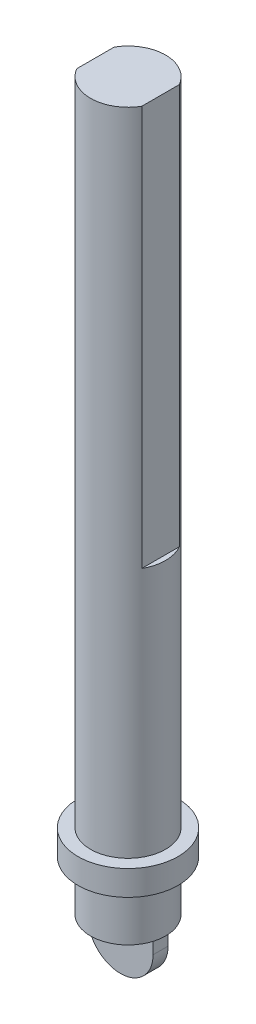
ISO-10303-21;
HEADER;
FILE_DESCRIPTION(('STEP AP214'),'2;1');
FILE_NAME('part.step','',(''),(''),'','','');
FILE_SCHEMA(('AUTOMOTIVE_DESIGN { 1 0 10303 214 1 1 1 1 }'));
ENDSEC;
DATA;
#1=APPLICATION_CONTEXT('core data for automotive mechanical design processes');
#2=APPLICATION_PROTOCOL_DEFINITION('international standard','automotive_design',2000,#1);
#3=PRODUCT_CONTEXT('',#1,'mechanical');
#4=PRODUCT('Part','Part','',(#3));
#5=PRODUCT_RELATED_PRODUCT_CATEGORY('part','',(#4));
#6=PRODUCT_DEFINITION_FORMATION('','',#4);
#7=PRODUCT_DEFINITION_CONTEXT('part definition',#1,'design');
#8=PRODUCT_DEFINITION('design','',#6,#7);
#9=PRODUCT_DEFINITION_SHAPE('','',#8);
#10=(LENGTH_UNIT() NAMED_UNIT(*) SI_UNIT(.MILLI.,.METRE.));
#11=(NAMED_UNIT(*) PLANE_ANGLE_UNIT() SI_UNIT($,.RADIAN.));
#12=(NAMED_UNIT(*) SI_UNIT($,.STERADIAN.) SOLID_ANGLE_UNIT());
#13=UNCERTAINTY_MEASURE_WITH_UNIT(LENGTH_MEASURE(1.E-05),#10,'distance_accuracy_value','');
#14=(GEOMETRIC_REPRESENTATION_CONTEXT(3) GLOBAL_UNCERTAINTY_ASSIGNED_CONTEXT((#13)) GLOBAL_UNIT_ASSIGNED_CONTEXT((#10,
#11,#12)) REPRESENTATION_CONTEXT('',''));
#15=CARTESIAN_POINT('',(0.,0.,0.));
#16=DIRECTION('',(0.,0.,1.));
#17=DIRECTION('',(1.,0.,0.));
#18=AXIS2_PLACEMENT_3D('',#15,#16,#17);
#19=CARTESIAN_POINT('',(0.,-15.,0.));
#20=DIRECTION('',(0.,-1.,0.));
#21=DIRECTION('',(0.,0.,-1.));
#22=AXIS2_PLACEMENT_3D('',#19,#20,#21);
#23=PLANE('',#22);
#24=CARTESIAN_POINT('',(0.,-15.,0.));
#25=DIRECTION('',(0.,-1.,0.));
#26=DIRECTION('',(0.,0.,-1.));
#27=AXIS2_PLACEMENT_3D('',#24,#25,#26);
#28=CIRCLE('',#27,7.5);
#29=CARTESIAN_POINT('',(0.,-15.,-7.5));
#30=VERTEX_POINT('',#29);
#31=EDGE_CURVE('E181',#30,#30,#28,.T.);
#32=ORIENTED_EDGE('',*,*,#31,.T.);
#33=EDGE_LOOP('',(#32));
#34=FACE_BOUND('',#33,.T.);
#35=DIRECTION('',(-1.,0.,0.));
#36=VECTOR('',#35,1.);
#37=CARTESIAN_POINT('',(-6.5,-15.,-1.5));
#38=LINE('',#37,#36);
#39=CARTESIAN_POINT('',(6.5,-15.,-1.5));
#40=VERTEX_POINT('',#39);
#41=CARTESIAN_POINT('',(-6.5,-15.,-1.5));
#42=VERTEX_POINT('',#41);
#43=EDGE_CURVE('E172',#40,#42,#38,.T.);
#44=ORIENTED_EDGE('',*,*,#43,.T.);
#45=DIRECTION('',(0.,0.,1.));
#46=VECTOR('',#45,1.);
#47=CARTESIAN_POINT('',(-6.5,-15.,-1.5));
#48=LINE('',#47,#46);
#49=CARTESIAN_POINT('',(-6.5,-15.,1.5));
#50=VERTEX_POINT('',#49);
#51=EDGE_CURVE('E177',#42,#50,#48,.T.);
#52=ORIENTED_EDGE('',*,*,#51,.T.);
#53=DIRECTION('',(-1.,0.,0.));
#54=VECTOR('',#53,1.);
#55=CARTESIAN_POINT('',(-6.5,-15.,1.5));
#56=LINE('',#55,#54);
#57=CARTESIAN_POINT('',(6.5,-15.,1.5));
#58=VERTEX_POINT('',#57);
#59=EDGE_CURVE('E158',#58,#50,#56,.T.);
#60=ORIENTED_EDGE('',*,*,#59,.F.);
#61=DIRECTION('',(0.,0.,1.));
#62=VECTOR('',#61,1.);
#63=CARTESIAN_POINT('',(6.5,-15.,-1.5));
#64=LINE('',#63,#62);
#65=EDGE_CURVE('E182',#40,#58,#64,.T.);
#66=ORIENTED_EDGE('',*,*,#65,.F.);
#67=EDGE_LOOP('',(#44,#52,#60,#66));
#68=FACE_BOUND('',#67,.T.);
#69=ADVANCED_FACE('F39',(#34,#68),#23,.T.);
#70=CARTESIAN_POINT('',(0.,130.,0.));
#71=DIRECTION('',(0.,-1.,0.));
#72=DIRECTION('',(0.,0.,-1.));
#73=AXIS2_PLACEMENT_3D('',#70,#71,#72);
#74=CYLINDRICAL_SURFACE('',#73,7.5);
#75=CARTESIAN_POINT('',(0.,130.,0.));
#76=DIRECTION('',(0.,1.,0.));
#77=DIRECTION('',(0.,0.,1.));
#78=AXIS2_PLACEMENT_3D('',#75,#76,#77);
#79=CIRCLE('',#78,7.5);
#80=CARTESIAN_POINT('',(6.5,130.,-3.74165738677394));
#81=VERTEX_POINT('',#80);
#82=CARTESIAN_POINT('',(-6.5,130.,-3.74165738677394));
#83=VERTEX_POINT('',#82);
#84=EDGE_CURVE('E49',#81,#83,#79,.T.);
#85=ORIENTED_EDGE('',*,*,#84,.F.);
#86=DIRECTION('',(0.,1.,0.));
#87=VECTOR('',#86,1.);
#88=CARTESIAN_POINT('',(6.5,50.,-3.74165738677394));
#89=LINE('',#88,#87);
#90=CARTESIAN_POINT('',(6.5,50.,-3.74165738677394));
#91=VERTEX_POINT('',#90);
#92=EDGE_CURVE('E65',#91,#81,#89,.T.);
#93=ORIENTED_EDGE('',*,*,#92,.F.);
#94=CARTESIAN_POINT('',(0.,50.,0.));
#95=DIRECTION('',(0.,1.,0.));
#96=DIRECTION('',(0.,0.,1.));
#97=AXIS2_PLACEMENT_3D('',#94,#95,#96);
#98=CIRCLE('',#97,7.5);
#99=CARTESIAN_POINT('',(6.5,50.,3.74165738677394));
#100=VERTEX_POINT('',#99);
#101=EDGE_CURVE('E109',#100,#91,#98,.T.);
#102=ORIENTED_EDGE('',*,*,#101,.F.);
#103=DIRECTION('',(0.,1.,0.));
#104=VECTOR('',#103,1.);
#105=CARTESIAN_POINT('',(6.5,50.,3.74165738677394));
#106=LINE('',#105,#104);
#107=CARTESIAN_POINT('',(6.5,130.,3.74165738677394));
#108=VERTEX_POINT('',#107);
#109=EDGE_CURVE('E118',#100,#108,#106,.T.);
#110=ORIENTED_EDGE('',*,*,#109,.T.);
#111=CARTESIAN_POINT('',(-6.5,130.,3.74165738677394));
#112=VERTEX_POINT('',#111);
#113=EDGE_CURVE('E200',#112,#108,#79,.T.);
#114=ORIENTED_EDGE('',*,*,#113,.F.);
#115=DIRECTION('',(0.,1.,0.));
#116=VECTOR('',#115,1.);
#117=CARTESIAN_POINT('',(-6.5,50.,3.74165738677393));
#118=LINE('',#117,#116);
#119=CARTESIAN_POINT('',(-6.5,50.,3.74165738677393));
#120=VERTEX_POINT('',#119);
#121=EDGE_CURVE('E57',#120,#112,#118,.T.);
#122=ORIENTED_EDGE('',*,*,#121,.F.);
#123=CARTESIAN_POINT('',(0.,50.,0.));
#124=DIRECTION('',(0.,1.,0.));
#125=DIRECTION('',(0.,0.,-1.));
#126=AXIS2_PLACEMENT_3D('',#123,#124,#125);
#127=CIRCLE('',#126,7.5);
#128=CARTESIAN_POINT('',(-6.5,50.,-3.74165738677394));
#129=VERTEX_POINT('',#128);
#130=EDGE_CURVE('E132',#129,#120,#127,.T.);
#131=ORIENTED_EDGE('',*,*,#130,.F.);
#132=DIRECTION('',(0.,1.,0.));
#133=VECTOR('',#132,1.);
#134=CARTESIAN_POINT('',(-6.5,50.,-3.74165738677394));
#135=LINE('',#134,#133);
#136=EDGE_CURVE('E142',#129,#83,#135,.T.);
#137=ORIENTED_EDGE('',*,*,#136,.T.);
#138=EDGE_LOOP('',(#85,#93,#102,#110,#114,#122,#131,#137));
#139=FACE_BOUND('',#138,.T.);
#140=CARTESIAN_POINT('',(0.,0.,0.));
#141=DIRECTION('',(0.,1.,0.));
#142=DIRECTION('',(0.,0.,1.));
#143=AXIS2_PLACEMENT_3D('',#140,#141,#142);
#144=CIRCLE('',#143,7.5);
#145=CARTESIAN_POINT('',(0.,0.,7.5));
#146=VERTEX_POINT('',#145);
#147=EDGE_CURVE('E43',#146,#146,#144,.T.);
#148=ORIENTED_EDGE('',*,*,#147,.T.);
#149=EDGE_LOOP('',(#148));
#150=FACE_BOUND('',#149,.T.);
#151=ADVANCED_FACE('F41',(#139,#150),#74,.T.);
#152=CARTESIAN_POINT('',(0.,130.,0.));
#153=DIRECTION('',(0.,1.,0.));
#154=DIRECTION('',(0.,0.,1.));
#155=AXIS2_PLACEMENT_3D('',#152,#153,#154);
#156=PLANE('',#155);
#157=DIRECTION('',(0.,0.,1.));
#158=VECTOR('',#157,1.);
#159=CARTESIAN_POINT('',(6.5,130.,-3.74165738677394));
#160=LINE('',#159,#158);
#161=EDGE_CURVE('E115',#81,#108,#160,.T.);
#162=ORIENTED_EDGE('',*,*,#161,.F.);
#163=ORIENTED_EDGE('',*,*,#84,.T.);
#164=DIRECTION('',(0.,0.,-1.));
#165=VECTOR('',#164,1.);
#166=CARTESIAN_POINT('',(-6.5,130.,-3.74165738677394));
#167=LINE('',#166,#165);
#168=EDGE_CURVE('E136',#112,#83,#167,.T.);
#169=ORIENTED_EDGE('',*,*,#168,.F.);
#170=ORIENTED_EDGE('',*,*,#113,.T.);
#171=EDGE_LOOP('',(#162,#163,#169,#170));
#172=FACE_BOUND('',#171,.T.);
#173=ADVANCED_FACE('F220',(#172),#156,.T.);
#174=CARTESIAN_POINT('',(0.,-5.,0.));
#175=DIRECTION('',(0.,1.,0.));
#176=DIRECTION('',(0.,0.,1.));
#177=AXIS2_PLACEMENT_3D('',#174,#175,#176);
#178=CYLINDRICAL_SURFACE('',#177,10.);
#179=CARTESIAN_POINT('',(0.,-5.,0.));
#180=DIRECTION('',(0.,-1.,0.));
#181=DIRECTION('',(0.,0.,-1.));
#182=AXIS2_PLACEMENT_3D('',#179,#180,#181);
#183=CIRCLE('',#182,10.);
#184=CARTESIAN_POINT('',(0.,-5.,-10.));
#185=VERTEX_POINT('',#184);
#186=EDGE_CURVE('E194',#185,#185,#183,.T.);
#187=ORIENTED_EDGE('',*,*,#186,.F.);
#188=EDGE_LOOP('',(#187));
#189=FACE_BOUND('',#188,.T.);
#190=CARTESIAN_POINT('',(0.,0.,0.));
#191=DIRECTION('',(0.,-1.,0.));
#192=DIRECTION('',(0.,0.,-1.));
#193=AXIS2_PLACEMENT_3D('',#190,#191,#192);
#194=CIRCLE('',#193,10.);
#195=CARTESIAN_POINT('',(0.,0.,-10.));
#196=VERTEX_POINT('',#195);
#197=EDGE_CURVE('E192',#196,#196,#194,.T.);
#198=ORIENTED_EDGE('',*,*,#197,.T.);
#199=EDGE_LOOP('',(#198));
#200=FACE_BOUND('',#199,.T.);
#201=ADVANCED_FACE('F218',(#189,#200),#178,.T.);
#202=CARTESIAN_POINT('',(0.,-5.,0.));
#203=DIRECTION('',(0.,-1.,0.));
#204=DIRECTION('',(0.,0.,-1.));
#205=AXIS2_PLACEMENT_3D('',#202,#203,#204);
#206=PLANE('',#205);
#207=CARTESIAN_POINT('',(0.,-5.,0.));
#208=DIRECTION('',(0.,-1.,0.));
#209=DIRECTION('',(0.,0.,-1.));
#210=AXIS2_PLACEMENT_3D('',#207,#208,#209);
#211=CIRCLE('',#210,7.5);
#212=CARTESIAN_POINT('',(0.,-5.,-7.5));
#213=VERTEX_POINT('',#212);
#214=EDGE_CURVE('E11',#213,#213,#211,.T.);
#215=ORIENTED_EDGE('',*,*,#214,.F.);
#216=EDGE_LOOP('',(#215));
#217=FACE_BOUND('',#216,.T.);
#218=ORIENTED_EDGE('',*,*,#186,.T.);
#219=EDGE_LOOP('',(#218));
#220=FACE_BOUND('',#219,.T.);
#221=ADVANCED_FACE('F214',(#217,#220),#206,.T.);
#222=CARTESIAN_POINT('',(0.,0.,0.));
#223=DIRECTION('',(0.,-1.,0.));
#224=DIRECTION('',(0.,0.,-1.));
#225=AXIS2_PLACEMENT_3D('',#222,#223,#224);
#226=PLANE('',#225);
#227=ORIENTED_EDGE('',*,*,#147,.F.);
#228=EDGE_LOOP('',(#227));
#229=FACE_BOUND('',#228,.T.);
#230=ORIENTED_EDGE('',*,*,#197,.F.);
#231=EDGE_LOOP('',(#230));
#232=FACE_BOUND('',#231,.T.);
#233=ADVANCED_FACE('F210',(#229,#232),#226,.F.);
#234=CARTESIAN_POINT('',(0.,-15.,0.));
#235=DIRECTION('',(0.,1.,0.));
#236=DIRECTION('',(0.,0.,1.));
#237=AXIS2_PLACEMENT_3D('',#234,#235,#236);
#238=CYLINDRICAL_SURFACE('',#237,7.5);
#239=ORIENTED_EDGE('',*,*,#31,.F.);
#240=EDGE_LOOP('',(#239));
#241=FACE_BOUND('',#240,.T.);
#242=ORIENTED_EDGE('',*,*,#214,.T.);
#243=EDGE_LOOP('',(#242));
#244=FACE_BOUND('',#243,.T.);
#245=ADVANCED_FACE('F213',(#241,#244),#238,.T.);
#246=CARTESIAN_POINT('',(-6.5,-15.,-1.5));
#247=DIRECTION('',(-1.,0.,0.));
#248=DIRECTION('',(0.,0.,1.));
#249=AXIS2_PLACEMENT_3D('',#246,#247,#248);
#250=PLANE('',#249);
#251=DIRECTION('',(0.,0.,1.));
#252=VECTOR('',#251,1.);
#253=CARTESIAN_POINT('',(-6.5,-18.,-1.5));
#254=LINE('',#253,#252);
#255=CARTESIAN_POINT('',(-6.5,-18.,-1.5));
#256=VERTEX_POINT('',#255);
#257=CARTESIAN_POINT('',(-6.5,-18.,1.5));
#258=VERTEX_POINT('',#257);
#259=EDGE_CURVE('E176',#256,#258,#254,.T.);
#260=ORIENTED_EDGE('',*,*,#259,.T.);
#261=DIRECTION('',(0.,-1.,0.));
#262=VECTOR('',#261,1.);
#263=CARTESIAN_POINT('',(-6.5,-15.,1.5));
#264=LINE('',#263,#262);
#265=EDGE_CURVE('E128',#50,#258,#264,.T.);
#266=ORIENTED_EDGE('',*,*,#265,.F.);
#267=ORIENTED_EDGE('',*,*,#51,.F.);
#268=DIRECTION('',(0.,-1.,0.));
#269=VECTOR('',#268,1.);
#270=CARTESIAN_POINT('',(-6.5,-15.,-1.5));
#271=LINE('',#270,#269);
#272=EDGE_CURVE('E161',#42,#256,#271,.T.);
#273=ORIENTED_EDGE('',*,*,#272,.T.);
#274=EDGE_LOOP('',(#260,#266,#267,#273));
#275=FACE_BOUND('',#274,.T.);
#276=ADVANCED_FACE('F239',(#275),#250,.T.);
#277=CARTESIAN_POINT('',(6.5,-15.,-1.5));
#278=DIRECTION('',(1.,0.,0.));
#279=DIRECTION('',(0.,0.,-1.));
#280=AXIS2_PLACEMENT_3D('',#277,#278,#279);
#281=PLANE('',#280);
#282=ORIENTED_EDGE('',*,*,#65,.T.);
#283=DIRECTION('',(0.,1.,0.));
#284=VECTOR('',#283,1.);
#285=CARTESIAN_POINT('',(6.5,-15.,1.5));
#286=LINE('',#285,#284);
#287=CARTESIAN_POINT('',(6.5,-18.,1.5));
#288=VERTEX_POINT('',#287);
#289=EDGE_CURVE('E154',#288,#58,#286,.T.);
#290=ORIENTED_EDGE('',*,*,#289,.F.);
#291=DIRECTION('',(0.,0.,1.));
#292=VECTOR('',#291,1.);
#293=CARTESIAN_POINT('',(6.5,-18.,-1.5));
#294=LINE('',#293,#292);
#295=CARTESIAN_POINT('',(6.5,-18.,-1.5));
#296=VERTEX_POINT('',#295);
#297=EDGE_CURVE('E185',#296,#288,#294,.T.);
#298=ORIENTED_EDGE('',*,*,#297,.F.);
#299=DIRECTION('',(0.,1.,0.));
#300=VECTOR('',#299,1.);
#301=CARTESIAN_POINT('',(6.5,-15.,-1.5));
#302=LINE('',#301,#300);
#303=EDGE_CURVE('E169',#296,#40,#302,.T.);
#304=ORIENTED_EDGE('',*,*,#303,.T.);
#305=EDGE_LOOP('',(#282,#290,#298,#304));
#306=FACE_BOUND('',#305,.T.);
#307=ADVANCED_FACE('F246',(#306),#281,.T.);
#308=CARTESIAN_POINT('',(0.,-18.,-1.5));
#309=DIRECTION('',(0.,0.,1.));
#310=DIRECTION('',(1.,0.,0.));
#311=AXIS2_PLACEMENT_3D('',#308,#309,#310);
#312=CYLINDRICAL_SURFACE('',#311,6.5);
#313=ORIENTED_EDGE('',*,*,#297,.T.);
#314=CARTESIAN_POINT('',(0.,-18.,1.5));
#315=DIRECTION('',(0.,0.,1.));
#316=DIRECTION('',(1.,0.,0.));
#317=AXIS2_PLACEMENT_3D('',#314,#315,#316);
#318=CIRCLE('',#317,6.5);
#319=EDGE_CURVE('E150',#258,#288,#318,.T.);
#320=ORIENTED_EDGE('',*,*,#319,.F.);
#321=ORIENTED_EDGE('',*,*,#259,.F.);
#322=CARTESIAN_POINT('',(0.,-18.,-1.5));
#323=DIRECTION('',(0.,0.,1.));
#324=DIRECTION('',(1.,0.,0.));
#325=AXIS2_PLACEMENT_3D('',#322,#323,#324);
#326=CIRCLE('',#325,6.5);
#327=EDGE_CURVE('E165',#256,#296,#326,.T.);
#328=ORIENTED_EDGE('',*,*,#327,.T.);
#329=EDGE_LOOP('',(#313,#320,#321,#328));
#330=FACE_BOUND('',#329,.T.);
#331=ADVANCED_FACE('F255',(#330),#312,.T.);
#332=CARTESIAN_POINT('',(0.,-18.,-1.5));
#333=DIRECTION('',(0.,0.,1.));
#334=DIRECTION('',(1.,0.,0.));
#335=AXIS2_PLACEMENT_3D('',#332,#333,#334);
#336=PLANE('',#335);
#337=ORIENTED_EDGE('',*,*,#272,.F.);
#338=ORIENTED_EDGE('',*,*,#43,.F.);
#339=ORIENTED_EDGE('',*,*,#303,.F.);
#340=ORIENTED_EDGE('',*,*,#327,.F.);
#341=EDGE_LOOP('',(#337,#338,#339,#340));
#342=FACE_BOUND('',#341,.T.);
#343=ADVANCED_FACE('F271',(#342),#336,.F.);
#344=CARTESIAN_POINT('',(0.,-18.,1.5));
#345=DIRECTION('',(0.,0.,1.));
#346=DIRECTION('',(1.,0.,0.));
#347=AXIS2_PLACEMENT_3D('',#344,#345,#346);
#348=PLANE('',#347);
#349=ORIENTED_EDGE('',*,*,#265,.T.);
#350=ORIENTED_EDGE('',*,*,#319,.T.);
#351=ORIENTED_EDGE('',*,*,#289,.T.);
#352=ORIENTED_EDGE('',*,*,#59,.T.);
#353=EDGE_LOOP('',(#349,#350,#351,#352));
#354=FACE_BOUND('',#353,.T.);
#355=ADVANCED_FACE('F265',(#354),#348,.T.);
#356=CARTESIAN_POINT('',(-6.5,50.,-3.74165738677394));
#357=DIRECTION('',(1.,0.,0.));
#358=DIRECTION('',(0.,0.,-1.));
#359=AXIS2_PLACEMENT_3D('',#356,#357,#358);
#360=PLANE('',#359);
#361=ORIENTED_EDGE('',*,*,#168,.T.);
#362=ORIENTED_EDGE('',*,*,#136,.F.);
#363=DIRECTION('',(0.,0.,-1.));
#364=VECTOR('',#363,1.);
#365=CARTESIAN_POINT('',(-6.5,50.,-3.74165738677394));
#366=LINE('',#365,#364);
#367=EDGE_CURVE('E135',#120,#129,#366,.T.);
#368=ORIENTED_EDGE('',*,*,#367,.F.);
#369=ORIENTED_EDGE('',*,*,#121,.T.);
#370=EDGE_LOOP('',(#361,#362,#368,#369));
#371=FACE_BOUND('',#370,.T.);
#372=ADVANCED_FACE('F278',(#371),#360,.F.);
#373=CARTESIAN_POINT('',(0.,50.,0.));
#374=DIRECTION('',(0.,-1.,0.));
#375=DIRECTION('',(0.,0.,-1.));
#376=AXIS2_PLACEMENT_3D('',#373,#374,#375);
#377=PLANE('',#376);
#378=ORIENTED_EDGE('',*,*,#130,.T.);
#379=ORIENTED_EDGE('',*,*,#367,.T.);
#380=EDGE_LOOP('',(#378,#379));
#381=FACE_BOUND('',#380,.T.);
#382=ADVANCED_FACE('F283',(#381),#377,.F.);
#383=CARTESIAN_POINT('',(6.5,50.,-3.74165738677394));
#384=DIRECTION('',(-1.,0.,0.));
#385=DIRECTION('',(0.,0.,1.));
#386=AXIS2_PLACEMENT_3D('',#383,#384,#385);
#387=PLANE('',#386);
#388=ORIENTED_EDGE('',*,*,#161,.T.);
#389=ORIENTED_EDGE('',*,*,#109,.F.);
#390=DIRECTION('',(0.,0.,1.));
#391=VECTOR('',#390,1.);
#392=CARTESIAN_POINT('',(6.5,50.,-3.74165738677394));
#393=LINE('',#392,#391);
#394=EDGE_CURVE('E111',#91,#100,#393,.T.);
#395=ORIENTED_EDGE('',*,*,#394,.F.);
#396=ORIENTED_EDGE('',*,*,#92,.T.);
#397=EDGE_LOOP('',(#388,#389,#395,#396));
#398=FACE_BOUND('',#397,.T.);
#399=ADVANCED_FACE('F117',(#398),#387,.F.);
#400=CARTESIAN_POINT('',(0.,50.,0.));
#401=DIRECTION('',(0.,1.,0.));
#402=DIRECTION('',(0.,0.,1.));
#403=AXIS2_PLACEMENT_3D('',#400,#401,#402);
#404=PLANE('',#403);
#405=ORIENTED_EDGE('',*,*,#101,.T.);
#406=ORIENTED_EDGE('',*,*,#394,.T.);
#407=EDGE_LOOP('',(#405,#406));
#408=FACE_BOUND('',#407,.T.);
#409=ADVANCED_FACE('F110',(#408),#404,.T.);
#410=CLOSED_SHELL('',(#69,#151,#173,#201,#221,#233,#245,#276,#307,#331,#343,#355,#372,#382,#399,#409));
#411=MANIFOLD_SOLID_BREP('B2',#410);
#412=ADVANCED_BREP_SHAPE_REPRESENTATION('',(#18,#411),#14);
#413=SHAPE_DEFINITION_REPRESENTATION(#9,#412);
ENDSEC;
END-ISO-10303-21;
